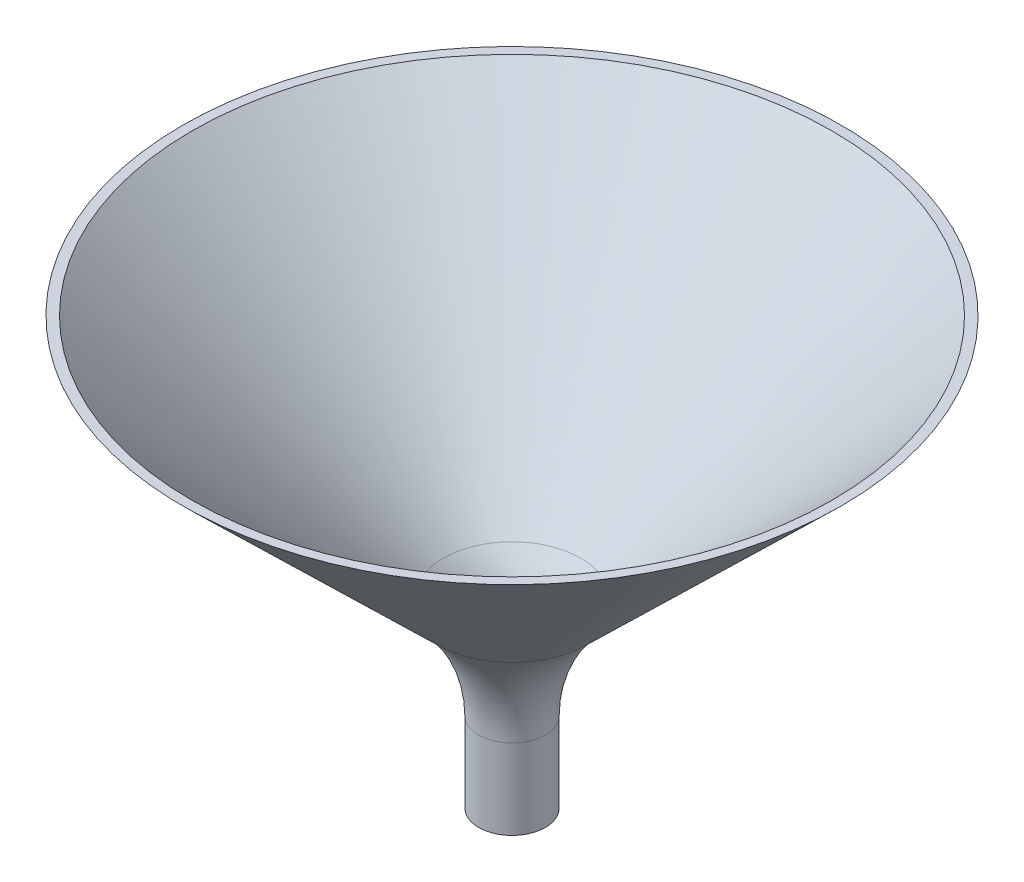
ISO-10303-21;
HEADER;
FILE_DESCRIPTION(('STEP AP214'),'2;1');
FILE_NAME('part.step','',(''),(''),'','','');
FILE_SCHEMA(('AUTOMOTIVE_DESIGN { 1 0 10303 214 1 1 1 1 }'));
ENDSEC;
DATA;
#1=APPLICATION_CONTEXT('core data for automotive mechanical design processes');
#2=APPLICATION_PROTOCOL_DEFINITION('international standard','automotive_design',2000,#1);
#3=PRODUCT_CONTEXT('',#1,'mechanical');
#4=PRODUCT('Part','Part','',(#3));
#5=PRODUCT_RELATED_PRODUCT_CATEGORY('part','',(#4));
#6=PRODUCT_DEFINITION_FORMATION('','',#4);
#7=PRODUCT_DEFINITION_CONTEXT('part definition',#1,'design');
#8=PRODUCT_DEFINITION('design','',#6,#7);
#9=PRODUCT_DEFINITION_SHAPE('','',#8);
#10=(LENGTH_UNIT() NAMED_UNIT(*) SI_UNIT(.MILLI.,.METRE.));
#11=(NAMED_UNIT(*) PLANE_ANGLE_UNIT() SI_UNIT($,.RADIAN.));
#12=(NAMED_UNIT(*) SI_UNIT($,.STERADIAN.) SOLID_ANGLE_UNIT());
#13=UNCERTAINTY_MEASURE_WITH_UNIT(LENGTH_MEASURE(1.E-05),#10,'distance_accuracy_value','');
#14=(GEOMETRIC_REPRESENTATION_CONTEXT(3) GLOBAL_UNCERTAINTY_ASSIGNED_CONTEXT((#13)) GLOBAL_UNIT_ASSIGNED_CONTEXT((#10,
#11,#12)) REPRESENTATION_CONTEXT('',''));
#15=CARTESIAN_POINT('',(0.,0.,0.));
#16=DIRECTION('',(0.,0.,1.));
#17=DIRECTION('',(1.,0.,0.));
#18=AXIS2_PLACEMENT_3D('',#15,#16,#17);
#19=CARTESIAN_POINT('',(3.175,0.,0.));
#20=DIRECTION('',(0.,-1.,0.));
#21=DIRECTION('',(1.,0.,0.));
#22=AXIS2_PLACEMENT_3D('',#19,#20,#21);
#23=PLANE('',#22);
#24=CARTESIAN_POINT('',(0.,0.,0.));
#25=DIRECTION('',(0.,-1.,0.));
#26=DIRECTION('',(1.,0.,0.));
#27=AXIS2_PLACEMENT_3D('',#24,#25,#26);
#28=CIRCLE('',#27,3.175);
#29=CARTESIAN_POINT('',(-0.6,0.,3.11779168643448));
#30=VERTEX_POINT('',#29);
#31=CARTESIAN_POINT('',(-0.600000000000001,0.,-3.11779168643449));
#32=VERTEX_POINT('',#31);
#33=EDGE_CURVE('E11',#30,#32,#28,.T.);
#34=ORIENTED_EDGE('',*,*,#33,.F.);
#35=DIRECTION('',(0.,0.,-1.));
#36=VECTOR('',#35,1.);
#37=CARTESIAN_POINT('',(-0.6,0.,3.92313351321364));
#38=LINE('',#37,#36);
#39=EDGE_CURVE('E79',#30,#32,#38,.T.);
#40=ORIENTED_EDGE('',*,*,#39,.T.);
#41=EDGE_LOOP('',(#34,#40));
#42=FACE_BOUND('',#41,.T.);
#43=CARTESIAN_POINT('',(0.6,0.,-3.11779168643448));
#44=VERTEX_POINT('',#43);
#45=CARTESIAN_POINT('',(0.600000000000001,0.,3.11779168643449));
#46=VERTEX_POINT('',#45);
#47=EDGE_CURVE('E42',#44,#46,#28,.T.);
#48=ORIENTED_EDGE('',*,*,#47,.F.);
#49=DIRECTION('',(0.,0.,1.));
#50=VECTOR('',#49,1.);
#51=CARTESIAN_POINT('',(0.6,0.,3.92313351321364));
#52=LINE('',#51,#50);
#53=EDGE_CURVE('E92',#44,#46,#52,.T.);
#54=ORIENTED_EDGE('',*,*,#53,.T.);
#55=EDGE_LOOP('',(#48,#54));
#56=FACE_BOUND('',#55,.T.);
#57=CARTESIAN_POINT('',(0.,0.,0.));
#58=DIRECTION('',(0.,-1.,0.));
#59=DIRECTION('',(1.,0.,0.));
#60=AXIS2_PLACEMENT_3D('',#57,#58,#59);
#61=CIRCLE('',#60,3.96875);
#62=CARTESIAN_POINT('',(3.96875,0.,0.));
#63=VERTEX_POINT('',#62);
#64=EDGE_CURVE('E113',#63,#63,#61,.T.);
#65=ORIENTED_EDGE('',*,*,#64,.T.);
#66=EDGE_LOOP('',(#65));
#67=FACE_BOUND('',#66,.T.);
#68=ADVANCED_FACE('F39',(#42,#56,#67),#23,.T.);
#69=CARTESIAN_POINT('',(0.,0.,0.));
#70=DIRECTION('',(0.,-1.,0.));
#71=DIRECTION('',(1.,0.,0.));
#72=AXIS2_PLACEMENT_3D('',#69,#70,#71);
#73=CYLINDRICAL_SURFACE('',#72,3.175);
#74=DIRECTION('',(0.,-1.,0.));
#75=VECTOR('',#74,1.);
#76=CARTESIAN_POINT('',(-0.6,0.,3.11779168643448));
#77=LINE('',#76,#75);
#78=CARTESIAN_POINT('',(-0.6,6.35,3.11779168643448));
#79=VERTEX_POINT('',#78);
#80=EDGE_CURVE('E81',#30,#79,#77,.F.);
#81=ORIENTED_EDGE('',*,*,#80,.F.);
#82=ORIENTED_EDGE('',*,*,#33,.T.);
#83=DIRECTION('',(0.,-1.,0.));
#84=VECTOR('',#83,1.);
#85=CARTESIAN_POINT('',(-0.6,0.,-3.11779168643448));
#86=LINE('',#85,#84);
#87=CARTESIAN_POINT('',(-0.6,6.35,-3.11779168643448));
#88=VERTEX_POINT('',#87);
#89=EDGE_CURVE('E88',#88,#32,#86,.T.);
#90=ORIENTED_EDGE('',*,*,#89,.F.);
#91=CARTESIAN_POINT('',(0.,6.35,0.));
#92=DIRECTION('',(0.,-1.,0.));
#93=DIRECTION('',(1.,0.,0.));
#94=AXIS2_PLACEMENT_3D('',#91,#92,#93);
#95=CIRCLE('',#94,3.175);
#96=CARTESIAN_POINT('',(0.6,6.35,-3.11779168643448));
#97=VERTEX_POINT('',#96);
#98=EDGE_CURVE('E102',#88,#97,#95,.T.);
#99=ORIENTED_EDGE('',*,*,#98,.T.);
#100=DIRECTION('',(0.,-1.,0.));
#101=VECTOR('',#100,1.);
#102=CARTESIAN_POINT('',(0.6,0.,-3.11779168643448));
#103=LINE('',#102,#101);
#104=EDGE_CURVE('E105',#44,#97,#103,.F.);
#105=ORIENTED_EDGE('',*,*,#104,.F.);
#106=ORIENTED_EDGE('',*,*,#47,.T.);
#107=DIRECTION('',(0.,-1.,0.));
#108=VECTOR('',#107,1.);
#109=CARTESIAN_POINT('',(0.6,0.,3.11779168643448));
#110=LINE('',#109,#108);
#111=CARTESIAN_POINT('',(0.6,6.35,3.11779168643448));
#112=VERTEX_POINT('',#111);
#113=EDGE_CURVE('E59',#112,#46,#110,.T.);
#114=ORIENTED_EDGE('',*,*,#113,.F.);
#115=EDGE_CURVE('E54',#112,#79,#95,.T.);
#116=ORIENTED_EDGE('',*,*,#115,.T.);
#117=EDGE_LOOP('',(#81,#82,#90,#99,#105,#106,#114,#116));
#118=FACE_BOUND('',#117,.T.);
#119=CARTESIAN_POINT('',(0.,9.87004715977678,0.));
#120=DIRECTION('',(0.,-1.,0.));
#121=DIRECTION('',(1.,0.,0.));
#122=AXIS2_PLACEMENT_3D('',#119,#120,#121);
#123=CIRCLE('',#122,3.17499999999999);
#124=CARTESIAN_POINT('',(3.17499999999999,9.87004715977678,0.));
#125=VERTEX_POINT('',#124);
#126=EDGE_CURVE('E136',#125,#125,#123,.T.);
#127=ORIENTED_EDGE('',*,*,#126,.F.);
#128=EDGE_LOOP('',(#127));
#129=FACE_BOUND('',#128,.T.);
#130=ADVANCED_FACE('F82',(#118,#129),#73,.F.);
#131=CARTESIAN_POINT('',(0.,9.87004715977677,0.));
#132=DIRECTION('',(0.,-1.,0.));
#133=DIRECTION('',(1.,0.,0.));
#134=AXIS2_PLACEMENT_3D('',#131,#132,#133);
#135=TOROIDAL_SURFACE('',#134,19.685,16.51);
#136=ORIENTED_EDGE('',*,*,#126,.T.);
#137=EDGE_LOOP('',(#136));
#138=FACE_BOUND('',#137,.T.);
#139=CARTESIAN_POINT('',(0.,21.7076692280007,0.));
#140=DIRECTION('',(0.,-1.,0.));
#141=DIRECTION('',(1.,0.,0.));
#142=AXIS2_PLACEMENT_3D('',#139,#140,#141);
#143=CIRCLE('',#142,8.17627271285407);
#144=CARTESIAN_POINT('',(-8.17627271285406,21.7076692280007,0.));
#145=VERTEX_POINT('',#144);
#146=EDGE_CURVE('E133',#145,#145,#143,.T.);
#147=ORIENTED_EDGE('',*,*,#146,.F.);
#148=EDGE_LOOP('',(#147));
#149=FACE_BOUND('',#148,.T.);
#150=ADVANCED_FACE('F177',(#138,#149),#135,.T.);
#151=CARTESIAN_POINT('',(0.,50.8,0.));
#152=DIRECTION('',(0.,1.,0.));
#153=DIRECTION('',(-1.,0.,0.));
#154=AXIS2_PLACEMENT_3D('',#151,#152,#153);
#155=CONICAL_SURFACE('',#154,38.1,0.799484863678733);
#156=CARTESIAN_POINT('',(0.,50.8,0.));
#157=DIRECTION('',(0.,-1.,0.));
#158=DIRECTION('',(1.,0.,0.));
#159=AXIS2_PLACEMENT_3D('',#156,#157,#158);
#160=CIRCLE('',#159,38.1);
#161=CARTESIAN_POINT('',(-38.1,50.8,0.));
#162=VERTEX_POINT('',#161);
#163=EDGE_CURVE('E129',#162,#162,#160,.T.);
#164=CARTESIAN_POINT('',(-8.17627271285406,21.7076692280007,0.));
#165=CARTESIAN_POINT('',(-8.4879782054285,22.0107143402091,0.));
#166=CARTESIAN_POINT('',(-8.79968369800294,22.3137594524174,0.));
#167=CARTESIAN_POINT('',(-9.42309468315181,22.919849676834,0.));
#168=CARTESIAN_POINT('',(-9.73480017572625,23.2228947890424,0.));
#169=CARTESIAN_POINT('',(-10.3582111608751,23.828985013459,0.));
#170=CARTESIAN_POINT('',(-10.6699166534496,24.1320301256673,0.));
#171=CARTESIAN_POINT('',(-11.2933276385984,24.738120350084,0.));
#172=CARTESIAN_POINT('',(-11.6050331311729,25.0411654622923,0.));
#173=CARTESIAN_POINT('',(-12.2284441163217,25.647255686709,0.));
#174=CARTESIAN_POINT('',(-12.5401496088962,25.9503007989173,0.));
#175=CARTESIAN_POINT('',(-13.1635605940451,26.556391023334,0.));
#176=CARTESIAN_POINT('',(-13.4752660866195,26.8594361355423,0.));
#177=CARTESIAN_POINT('',(-14.0986770717684,27.4655263599589,0.));
#178=CARTESIAN_POINT('',(-14.4103825643428,27.7685714721673,0.));
#179=CARTESIAN_POINT('',(-15.0337935494917,28.3746616965839,0.));
#180=CARTESIAN_POINT('',(-15.3454990420661,28.6777068087922,0.));
#181=CARTESIAN_POINT('',(-15.968910027215,29.2837970332089,0.));
#182=CARTESIAN_POINT('',(-16.2806155197894,29.5868421454172,0.));
#183=CARTESIAN_POINT('',(-16.9040265049383,30.1929323698339,0.));
#184=CARTESIAN_POINT('',(-17.2157319975127,30.4959774820422,0.));
#185=CARTESIAN_POINT('',(-17.8391429826616,31.1020677064588,0.));
#186=CARTESIAN_POINT('',(-18.150848475236,31.4051128186672,0.));
#187=CARTESIAN_POINT('',(-18.7742594603849,32.0112030430838,0.));
#188=CARTESIAN_POINT('',(-19.0859649529594,32.3142481552921,0.));
#189=CARTESIAN_POINT('',(-19.7093759381082,32.9203383797088,0.));
#190=CARTESIAN_POINT('',(-20.0210814306827,33.2233834919171,0.));
#191=CARTESIAN_POINT('',(-20.6444924158315,33.8294737163338,0.));
#192=CARTESIAN_POINT('',(-20.956197908406,34.1325188285421,0.));
#193=CARTESIAN_POINT('',(-21.5796088935549,34.7386090529587,0.));
#194=CARTESIAN_POINT('',(-21.8913143861293,35.0416541651671,0.));
#195=CARTESIAN_POINT('',(-22.5147253712782,35.6477443895837,0.));
#196=CARTESIAN_POINT('',(-22.8264308638526,35.950789501792,0.));
#197=CARTESIAN_POINT('',(-23.4498418490015,36.5568797262087,0.));
#198=CARTESIAN_POINT('',(-23.7615473415759,36.859924838417,0.));
#199=CARTESIAN_POINT('',(-24.3849583267248,37.4660150628337,0.));
#200=CARTESIAN_POINT('',(-24.6966638192992,37.769060175042,0.));
#201=CARTESIAN_POINT('',(-25.3200748044481,38.3751503994586,0.));
#202=CARTESIAN_POINT('',(-25.6317802970225,38.678195511667,0.));
#203=CARTESIAN_POINT('',(-26.2551912821714,39.2842857360836,0.));
#204=CARTESIAN_POINT('',(-26.5668967747458,39.587330848292,0.));
#205=CARTESIAN_POINT('',(-27.1903077598947,40.1934210727086,0.));
#206=CARTESIAN_POINT('',(-27.5020132524692,40.4964661849169,0.));
#207=CARTESIAN_POINT('',(-28.125424237618,41.1025564093336,0.));
#208=CARTESIAN_POINT('',(-28.4371297301925,41.4056015215419,0.));
#209=CARTESIAN_POINT('',(-29.0605407153413,42.0116917459586,0.));
#210=CARTESIAN_POINT('',(-29.3722462079158,42.3147368581669,0.));
#211=CARTESIAN_POINT('',(-29.9956571930646,42.9208270825835,0.));
#212=CARTESIAN_POINT('',(-30.3073626856391,43.2238721947919,0.));
#213=CARTESIAN_POINT('',(-30.930773670788,43.8299624192085,0.));
#214=CARTESIAN_POINT('',(-31.2424791633624,44.1330075314168,0.));
#215=CARTESIAN_POINT('',(-31.8658901485113,44.7390977558335,0.));
#216=CARTESIAN_POINT('',(-32.1775956410857,45.0421428680418,0.));
#217=CARTESIAN_POINT('',(-32.8010066262346,45.6482330924585,0.));
#218=CARTESIAN_POINT('',(-33.112712118809,45.9512782046668,0.));
#219=CARTESIAN_POINT('',(-33.7361231039579,46.5573684290834,0.));
#220=CARTESIAN_POINT('',(-34.0478285965323,46.8604135412918,0.));
#221=CARTESIAN_POINT('',(-34.6712395816812,47.4665037657084,0.));
#222=CARTESIAN_POINT('',(-34.9829450742556,47.7695488779167,0.));
#223=CARTESIAN_POINT('',(-35.6063560594045,48.3756391023334,0.));
#224=CARTESIAN_POINT('',(-35.918061551979,48.6786842145417,0.));
#225=CARTESIAN_POINT('',(-36.5414725371278,49.2847744389584,0.));
#226=CARTESIAN_POINT('',(-36.8531780297023,49.5878195511667,0.));
#227=CARTESIAN_POINT('',(-37.4765890148511,50.1939097755834,0.));
#228=CARTESIAN_POINT('',(-37.7882945074256,50.4969548877917,0.));
#229=CARTESIAN_POINT('',(-38.1,50.8,0.));
#230=B_SPLINE_CURVE_WITH_KNOTS('',3,(#164,#165,#166,#167,#168,#169,#170,#171,#172,#173,#174,
#175,#176,#177,#178,#179,#180,#181,#182,#183,#184,#185,#186,#187,#188,#189,#190,#191,#192,#193,
#194,#195,#196,#197,#198,#199,#200,#201,#202,#203,#204,#205,#206,#207,#208,#209,#210,#211,#212,
#213,#214,#215,#216,#217,#218,#219,#220,#221,#222,#223,#224,#225,#226,#227,#228,#229),
.UNSPECIFIED.,.F.,.F.,(4,2,2,2,2,2,2,2,2,2,2,2,2,2,2,2,2,2,2,2,2,2,2,2,2,2,2,2,2,2,2,2,4),(0.,
1.30421236277297,2.60842472554594,3.91263708831892,5.21684945109189,6.52106181386486,
7.82527417663784,9.12948653941081,10.4336989021838,11.7379112649568,13.0421236277297,
14.3463359905027,15.6505483532757,16.9547607160486,18.2589730788216,19.5631854415946,
20.8673978043676,22.1716101671405,23.4758225299135,24.7800348926865,26.0842472554595,
27.3884596182324,28.6926719810054,29.9968843437784,31.3010967065514,32.6053090693243,
33.9095214320973,35.2137337948703,36.5179461576432,37.8221585204162,39.1263708831892,
40.4305832459622,41.7347956087351),.UNSPECIFIED.);
#231=EDGE_CURVE('BSEAM173',#145,#162,#230,.T.);
#232=ORIENTED_EDGE('',*,*,#146,.T.);
#233=ORIENTED_EDGE('',*,*,#163,.F.);
#234=ORIENTED_EDGE('',*,*,#231,.T.);
#235=ORIENTED_EDGE('',*,*,#231,.F.);
#236=EDGE_LOOP('',(#232,#234,#233,#235));
#237=FACE_BOUND('',#236,.T.);
#238=ADVANCED_FACE('F173',(#237),#155,.F.);
#239=CARTESIAN_POINT('',(39.238684771394,50.8,0.));
#240=DIRECTION('',(0.,1.,0.));
#241=DIRECTION('',(-1.,0.,0.));
#242=AXIS2_PLACEMENT_3D('',#239,#240,#241);
#243=PLANE('',#242);
#244=ORIENTED_EDGE('',*,*,#163,.T.);
#245=EDGE_LOOP('',(#244));
#246=FACE_BOUND('',#245,.T.);
#247=CARTESIAN_POINT('',(0.,50.8,0.));
#248=DIRECTION('',(0.,-1.,0.));
#249=DIRECTION('',(1.,0.,0.));
#250=AXIS2_PLACEMENT_3D('',#247,#248,#249);
#251=CIRCLE('',#250,39.238684771394);
#252=CARTESIAN_POINT('',(-39.238684771394,50.8,0.));
#253=VERTEX_POINT('',#252);
#254=EDGE_CURVE('E125',#253,#253,#251,.T.);
#255=ORIENTED_EDGE('',*,*,#254,.F.);
#256=EDGE_LOOP('',(#255));
#257=FACE_BOUND('',#256,.T.);
#258=ADVANCED_FACE('F166',(#246,#257),#243,.T.);
#259=CARTESIAN_POINT('',(0.,21.3723180744541,0.));
#260=DIRECTION('',(0.,1.,0.));
#261=DIRECTION('',(-1.,0.,0.));
#262=AXIS2_PLACEMENT_3D('',#259,#260,#261);
#263=CONICAL_SURFACE('',#262,8.97002271285407,0.799484863678733);
#264=CARTESIAN_POINT('',(0.,21.3723180744541,0.));
#265=DIRECTION('',(0.,-1.,0.));
#266=DIRECTION('',(1.,0.,0.));
#267=AXIS2_PLACEMENT_3D('',#264,#265,#266);
#268=CIRCLE('',#267,8.97002271285407);
#269=CARTESIAN_POINT('',(-8.97002271285407,21.3723180744541,0.));
#270=VERTEX_POINT('',#269);
#271=EDGE_CURVE('E121',#270,#270,#268,.T.);
#272=CARTESIAN_POINT('',(-39.238684771394,50.8,0.));
#273=CARTESIAN_POINT('',(-38.9233862082842,50.4934616466089,0.));
#274=CARTESIAN_POINT('',(-38.6080876451745,50.1869232932178,0.));
#275=CARTESIAN_POINT('',(-37.9774905189549,49.5738465864356,0.));
#276=CARTESIAN_POINT('',(-37.6621919558451,49.2673082330445,0.));
#277=CARTESIAN_POINT('',(-37.0315948296255,48.6542315262623,0.));
#278=CARTESIAN_POINT('',(-36.7162962665157,48.3476931728712,0.));
#279=CARTESIAN_POINT('',(-36.0856991402961,47.734616466089,0.));
#280=CARTESIAN_POINT('',(-35.7704005771863,47.4280781126979,0.));
#281=CARTESIAN_POINT('',(-35.1398034509667,46.8150014059157,0.));
#282=CARTESIAN_POINT('',(-34.824504887857,46.5084630525246,0.));
#283=CARTESIAN_POINT('',(-34.1939077616374,45.8953863457424,0.));
#284=CARTESIAN_POINT('',(-33.8786091985276,45.5888479923513,0.));
#285=CARTESIAN_POINT('',(-33.248012072308,44.9757712855691,0.));
#286=CARTESIAN_POINT('',(-32.9327135091982,44.6692329321779,0.));
#287=CARTESIAN_POINT('',(-32.3021163829786,44.0561562253957,0.));
#288=CARTESIAN_POINT('',(-31.9868178198688,43.7496178720046,0.));
#289=CARTESIAN_POINT('',(-31.3562206936493,43.1365411652224,0.));
#290=CARTESIAN_POINT('',(-31.0409221305395,42.8300028118313,0.));
#291=CARTESIAN_POINT('',(-30.4103250043199,42.2169261050491,0.));
#292=CARTESIAN_POINT('',(-30.0950264412101,41.910387751658,0.));
#293=CARTESIAN_POINT('',(-29.4644293149905,41.2973110448758,0.));
#294=CARTESIAN_POINT('',(-29.1491307518807,40.9907726914847,0.));
#295=CARTESIAN_POINT('',(-28.5185336256611,40.3776959847025,0.));
#296=CARTESIAN_POINT('',(-28.2032350625513,40.0711576313114,0.));
#297=CARTESIAN_POINT('',(-27.5726379363318,39.4580809245292,0.));
#298=CARTESIAN_POINT('',(-27.257339373222,39.1515425711381,0.));
#299=CARTESIAN_POINT('',(-26.6267422470024,38.5384658643559,0.));
#300=CARTESIAN_POINT('',(-26.3114436838926,38.2319275109648,0.));
#301=CARTESIAN_POINT('',(-25.680846557673,37.6188508041826,0.));
#302=CARTESIAN_POINT('',(-25.3655479945632,37.3123124507915,0.));
#303=CARTESIAN_POINT('',(-24.7349508683436,36.6992357440093,0.));
#304=CARTESIAN_POINT('',(-24.4196523052338,36.3926973906182,0.));
#305=CARTESIAN_POINT('',(-23.7890551790143,35.779620683836,0.));
#306=CARTESIAN_POINT('',(-23.4737566159045,35.4730823304448,0.));
#307=CARTESIAN_POINT('',(-22.8431594896849,34.8600056236626,0.));
#308=CARTESIAN_POINT('',(-22.5278609265751,34.5534672702715,0.));
#309=CARTESIAN_POINT('',(-21.8972638003555,33.9403905634893,0.));
#310=CARTESIAN_POINT('',(-21.5819652372457,33.6338522100982,0.));
#311=CARTESIAN_POINT('',(-20.9513681110261,33.020775503316,0.));
#312=CARTESIAN_POINT('',(-20.6360695479163,32.7142371499249,0.));
#313=CARTESIAN_POINT('',(-20.0054724216968,32.1011604431427,0.));
#314=CARTESIAN_POINT('',(-19.690173858587,31.7946220897516,0.));
#315=CARTESIAN_POINT('',(-19.0595767323674,31.1815453829694,0.));
#316=CARTESIAN_POINT('',(-18.7442781692576,30.8750070295783,0.));
#317=CARTESIAN_POINT('',(-18.113681043038,30.2619303227961,0.));
#318=CARTESIAN_POINT('',(-17.7983824799282,29.955391969405,0.));
#319=CARTESIAN_POINT('',(-17.1677853537087,29.3423152626228,0.));
#320=CARTESIAN_POINT('',(-16.8524867905989,29.0357769092317,0.));
#321=CARTESIAN_POINT('',(-16.2218896643793,28.4227002024495,0.));
#322=CARTESIAN_POINT('',(-15.9065911012695,28.1161618490584,0.));
#323=CARTESIAN_POINT('',(-15.2759939750499,27.5030851422762,0.));
#324=CARTESIAN_POINT('',(-14.9606954119401,27.1965467888851,0.));
#325=CARTESIAN_POINT('',(-14.3300982857205,26.5834700821029,0.));
#326=CARTESIAN_POINT('',(-14.0147997226107,26.2769317287117,0.));
#327=CARTESIAN_POINT('',(-13.3842025963912,25.6638550219295,0.));
#328=CARTESIAN_POINT('',(-13.0689040332814,25.3573166685384,0.));
#329=CARTESIAN_POINT('',(-12.4383069070618,24.7442399617562,0.));
#330=CARTESIAN_POINT('',(-12.123008343952,24.4377016083651,0.));
#331=CARTESIAN_POINT('',(-11.4924112177324,23.8246249015829,0.));
#332=CARTESIAN_POINT('',(-11.1771126546226,23.5180865481918,0.));
#333=CARTESIAN_POINT('',(-10.546515528403,22.9050098414096,0.));
#334=CARTESIAN_POINT('',(-10.2312169652932,22.5984714880185,0.));
#335=CARTESIAN_POINT('',(-9.60061983907366,21.9853947812363,0.));
#336=CARTESIAN_POINT('',(-9.28532127596387,21.6788564278452,0.));
#337=CARTESIAN_POINT('',(-8.97002271285408,21.3723180744541,0.));
#338=B_SPLINE_CURVE_WITH_KNOTS('',3,(#272,#273,#274,#275,#276,#277,#278,#279,#280,#281,#282,
#283,#284,#285,#286,#287,#288,#289,#290,#291,#292,#293,#294,#295,#296,#297,#298,#299,#300,#301,
#302,#303,#304,#305,#306,#307,#308,#309,#310,#311,#312,#313,#314,#315,#316,#317,#318,#319,#320,
#321,#322,#323,#324,#325,#326,#327,#328,#329,#330,#331,#332,#333,#334,#335,#336,#337),
.UNSPECIFIED.,.F.,.F.,(4,2,2,2,2,2,2,2,2,2,2,2,2,2,2,2,2,2,2,2,2,2,2,2,2,2,2,2,2,2,2,2,4),(0.,
1.31924619157663,2.63849238315327,3.9577385747299,5.27698476630653,6.59623095788316,
7.9154771494598,9.23472334103644,10.5539695326131,11.8732157241897,13.1924619157663,
14.511708107343,15.8309542989196,17.1502004904962,18.4694466820729,19.7886928736495,
21.1079390652261,22.4271852568028,23.7464314483794,25.065677639956,26.3849238315327,
27.7041700231093,29.0234162146859,30.3426624062626,31.6619085978392,32.9811547894158,
34.3004009809925,35.6196471725691,36.9388933641457,38.2581395557224,39.577385747299,
40.8966319388756,42.2158781304523),.UNSPECIFIED.);
#339=EDGE_CURVE('BSEAM160',#253,#270,#338,.T.);
#340=ORIENTED_EDGE('',*,*,#254,.T.);
#341=ORIENTED_EDGE('',*,*,#271,.F.);
#342=ORIENTED_EDGE('',*,*,#339,.T.);
#343=ORIENTED_EDGE('',*,*,#339,.F.);
#344=EDGE_LOOP('',(#340,#342,#341,#343));
#345=FACE_BOUND('',#344,.T.);
#346=ADVANCED_FACE('F160',(#345),#263,.T.);
#347=CARTESIAN_POINT('',(0.,9.53469600623014,0.));
#348=DIRECTION('',(0.,-1.,0.));
#349=DIRECTION('',(1.,0.,0.));
#350=AXIS2_PLACEMENT_3D('',#347,#348,#349);
#351=TOROIDAL_SURFACE('',#350,20.47875,16.51);
#352=ORIENTED_EDGE('',*,*,#271,.T.);
#353=EDGE_LOOP('',(#352));
#354=FACE_BOUND('',#353,.T.);
#355=CARTESIAN_POINT('',(0.,9.53469600623014,0.));
#356=DIRECTION('',(0.,-1.,0.));
#357=DIRECTION('',(1.,0.,0.));
#358=AXIS2_PLACEMENT_3D('',#355,#356,#357);
#359=CIRCLE('',#358,3.96875);
#360=CARTESIAN_POINT('',(3.96875,9.53469600623014,0.));
#361=VERTEX_POINT('',#360);
#362=EDGE_CURVE('E117',#361,#361,#359,.T.);
#363=ORIENTED_EDGE('',*,*,#362,.F.);
#364=EDGE_LOOP('',(#363));
#365=FACE_BOUND('',#364,.T.);
#366=ADVANCED_FACE('F155',(#354,#365),#351,.F.);
#367=CARTESIAN_POINT('',(0.,0.,0.));
#368=DIRECTION('',(0.,-1.,0.));
#369=DIRECTION('',(1.,0.,0.));
#370=AXIS2_PLACEMENT_3D('',#367,#368,#369);
#371=CYLINDRICAL_SURFACE('',#370,3.96875);
#372=ORIENTED_EDGE('',*,*,#64,.F.);
#373=EDGE_LOOP('',(#372));
#374=FACE_BOUND('',#373,.T.);
#375=ORIENTED_EDGE('',*,*,#362,.T.);
#376=EDGE_LOOP('',(#375));
#377=FACE_BOUND('',#376,.T.);
#378=ADVANCED_FACE('F152',(#374,#377),#371,.T.);
#379=CARTESIAN_POINT('',(-0.6,6.35,3.92313351321364));
#380=DIRECTION('',(-1.,0.,0.));
#381=DIRECTION('',(0.,-1.,0.));
#382=AXIS2_PLACEMENT_3D('',#379,#380,#381);
#383=PLANE('',#382);
#384=DIRECTION('',(0.,0.,-1.));
#385=VECTOR('',#384,1.);
#386=CARTESIAN_POINT('',(-0.6,6.35,3.92313351321364));
#387=LINE('',#386,#385);
#388=EDGE_CURVE('E96',#79,#88,#387,.T.);
#389=ORIENTED_EDGE('',*,*,#388,.T.);
#390=ORIENTED_EDGE('',*,*,#89,.T.);
#391=ORIENTED_EDGE('',*,*,#39,.F.);
#392=ORIENTED_EDGE('',*,*,#80,.T.);
#393=EDGE_LOOP('',(#389,#390,#391,#392));
#394=FACE_BOUND('',#393,.T.);
#395=ADVANCED_FACE('F90',(#394),#383,.T.);
#396=CARTESIAN_POINT('',(0.6,6.35,3.92313351321364));
#397=DIRECTION('',(1.,0.,0.));
#398=DIRECTION('',(0.,1.,0.));
#399=AXIS2_PLACEMENT_3D('',#396,#397,#398);
#400=PLANE('',#399);
#401=DIRECTION('',(0.,0.,1.));
#402=VECTOR('',#401,1.);
#403=CARTESIAN_POINT('',(0.6,6.35,3.92313351321364));
#404=LINE('',#403,#402);
#405=EDGE_CURVE('E99',#97,#112,#404,.T.);
#406=ORIENTED_EDGE('',*,*,#405,.T.);
#407=ORIENTED_EDGE('',*,*,#113,.T.);
#408=ORIENTED_EDGE('',*,*,#53,.F.);
#409=ORIENTED_EDGE('',*,*,#104,.T.);
#410=EDGE_LOOP('',(#406,#407,#408,#409));
#411=FACE_BOUND('',#410,.T.);
#412=ADVANCED_FACE('F146',(#411),#400,.T.);
#413=CARTESIAN_POINT('',(0.,6.35,0.));
#414=DIRECTION('',(0.,-1.,0.));
#415=DIRECTION('',(1.,0.,0.));
#416=AXIS2_PLACEMENT_3D('',#413,#414,#415);
#417=PLANE('',#416);
#418=ORIENTED_EDGE('',*,*,#115,.F.);
#419=ORIENTED_EDGE('',*,*,#405,.F.);
#420=ORIENTED_EDGE('',*,*,#98,.F.);
#421=ORIENTED_EDGE('',*,*,#388,.F.);
#422=EDGE_LOOP('',(#418,#419,#420,#421));
#423=FACE_BOUND('',#422,.T.);
#424=ADVANCED_FACE('F232',(#423),#417,.F.);
#425=CLOSED_SHELL('',(#68,#130,#150,#238,#258,#346,#366,#378,#395,#412,#424));
#426=MANIFOLD_SOLID_BREP('B2',#425);
#427=ADVANCED_BREP_SHAPE_REPRESENTATION('',(#18,#426),#14);
#428=SHAPE_DEFINITION_REPRESENTATION(#9,#427);
ENDSEC;
END-ISO-10303-21;
